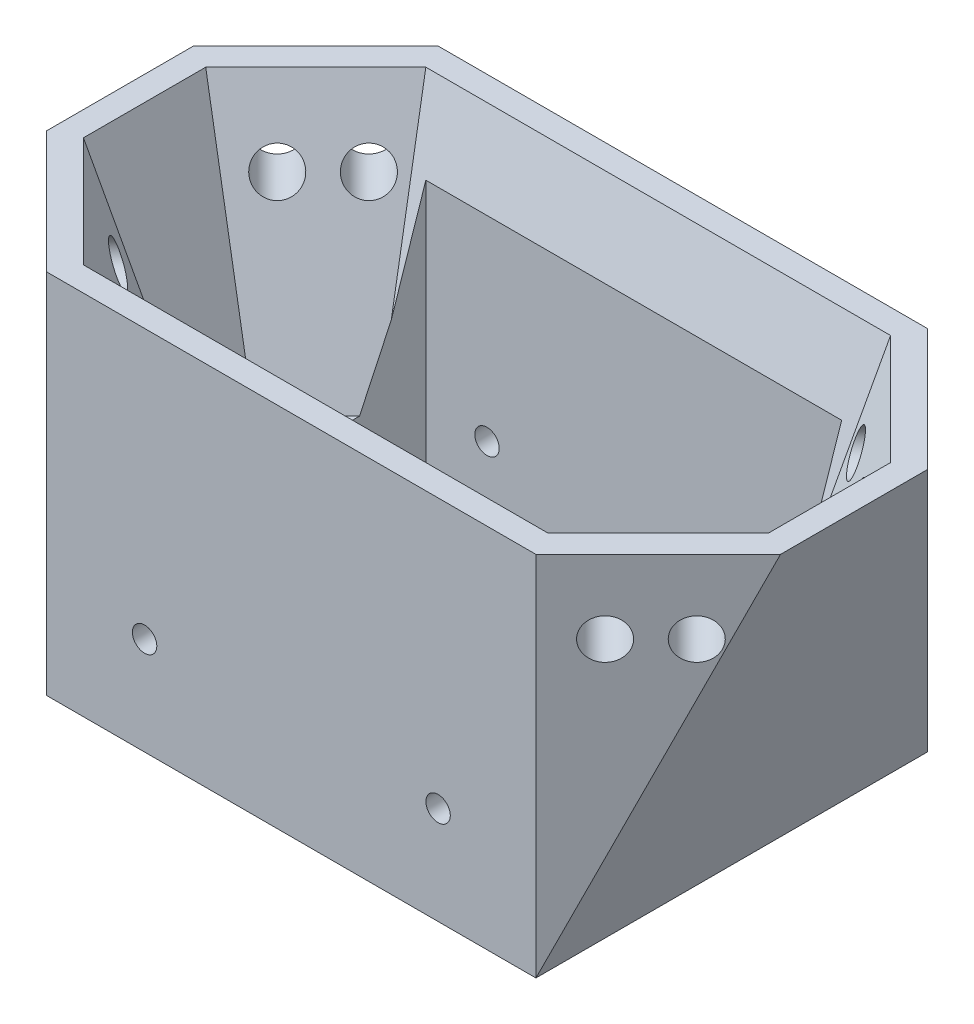
ISO-10303-21;
HEADER;
FILE_DESCRIPTION(('STEP AP214'),'2;1');
FILE_NAME('part.step','',(''),(''),'','','');
FILE_SCHEMA(('AUTOMOTIVE_DESIGN { 1 0 10303 214 1 1 1 1 }'));
ENDSEC;
DATA;
#1=APPLICATION_CONTEXT('core data for automotive mechanical design processes');
#2=APPLICATION_PROTOCOL_DEFINITION('international standard','automotive_design',2000,#1);
#3=PRODUCT_CONTEXT('',#1,'mechanical');
#4=PRODUCT('Part','Part','',(#3));
#5=PRODUCT_RELATED_PRODUCT_CATEGORY('part','',(#4));
#6=PRODUCT_DEFINITION_FORMATION('','',#4);
#7=PRODUCT_DEFINITION_CONTEXT('part definition',#1,'design');
#8=PRODUCT_DEFINITION('design','',#6,#7);
#9=PRODUCT_DEFINITION_SHAPE('','',#8);
#10=(LENGTH_UNIT() NAMED_UNIT(*) SI_UNIT(.MILLI.,.METRE.));
#11=(NAMED_UNIT(*) PLANE_ANGLE_UNIT() SI_UNIT($,.RADIAN.));
#12=(NAMED_UNIT(*) SI_UNIT($,.STERADIAN.) SOLID_ANGLE_UNIT());
#13=UNCERTAINTY_MEASURE_WITH_UNIT(LENGTH_MEASURE(1.E-05),#10,'distance_accuracy_value','');
#14=(GEOMETRIC_REPRESENTATION_CONTEXT(3) GLOBAL_UNCERTAINTY_ASSIGNED_CONTEXT((#13)) GLOBAL_UNIT_ASSIGNED_CONTEXT((#10,
#11,#12)) REPRESENTATION_CONTEXT('',''));
#15=CARTESIAN_POINT('',(0.,0.,0.));
#16=DIRECTION('',(0.,0.,1.));
#17=DIRECTION('',(1.,0.,0.));
#18=AXIS2_PLACEMENT_3D('',#15,#16,#17);
#19=CARTESIAN_POINT('',(-100.,150.,80.));
#20=DIRECTION('',(0.707106781186548,0.,-0.707106781186548));
#21=DIRECTION('',(-0.707106781186548,0.,-0.707106781186548));
#22=AXIS2_PLACEMENT_3D('',#19,#20,#21);
#23=PLANE('',#22);
#24=CARTESIAN_POINT('',(-114.142135623731,120.,65.857864376269));
#25=DIRECTION('',(-0.707106781186548,0.,0.707106781186547));
#26=DIRECTION('',(0.707106781186547,0.,0.707106781186548));
#27=AXIS2_PLACEMENT_3D('',#24,#25,#26);
#28=CIRCLE('',#27,8.25000000000001);
#29=CARTESIAN_POINT('',(-108.308504678942,120.,71.6914953210581));
#30=VERTEX_POINT('',#29);
#31=EDGE_CURVE('E357',#30,#30,#28,.T.);
#32=ORIENTED_EDGE('',*,*,#31,.F.);
#33=EDGE_LOOP('',(#32));
#34=FACE_BOUND('',#33,.T.);
#35=CARTESIAN_POINT('',(-132.880465325174,120.,47.1195346748255));
#36=DIRECTION('',(-0.707106781186548,0.,0.707106781186547));
#37=DIRECTION('',(0.707106781186547,0.,0.707106781186548));
#38=AXIS2_PLACEMENT_3D('',#35,#36,#37);
#39=CIRCLE('',#38,8.25000000000002);
#40=CARTESIAN_POINT('',(-127.046834380385,120.,52.9531656196146));
#41=VERTEX_POINT('',#40);
#42=EDGE_CURVE('E347',#41,#41,#39,.T.);
#43=ORIENTED_EDGE('',*,*,#42,.F.);
#44=EDGE_LOOP('',(#43));
#45=FACE_BOUND('',#44,.T.);
#46=DIRECTION('',(0.707106781186547,0.,0.707106781186547));
#47=VECTOR('',#46,1.);
#48=CARTESIAN_POINT('',(-100.,150.,80.));
#49=LINE('',#48,#47);
#50=CARTESIAN_POINT('',(-150.,150.,30.));
#51=VERTEX_POINT('',#50);
#52=CARTESIAN_POINT('',(-100.,150.,80.));
#53=VERTEX_POINT('',#52);
#54=EDGE_CURVE('E295',#51,#53,#49,.T.);
#55=ORIENTED_EDGE('',*,*,#54,.F.);
#56=DIRECTION('',(0.301511344577764,-0.904534033733291,0.301511344577764));
#57=VECTOR('',#56,1.);
#58=CARTESIAN_POINT('',(-140.909090909091,122.727272727273,39.0909090909091));
#59=LINE('',#58,#57);
#60=CARTESIAN_POINT('',(-100.,0.,80.));
#61=VERTEX_POINT('',#60);
#62=EDGE_CURVE('E288',#51,#61,#59,.T.);
#63=ORIENTED_EDGE('',*,*,#62,.T.);
#64=DIRECTION('',(0.,-1.,0.));
#65=VECTOR('',#64,1.);
#66=CARTESIAN_POINT('',(-100.,150.,80.));
#67=LINE('',#66,#65);
#68=EDGE_CURVE('E326',#53,#61,#67,.T.);
#69=ORIENTED_EDGE('',*,*,#68,.F.);
#70=EDGE_LOOP('',(#55,#63,#69));
#71=FACE_BOUND('',#70,.T.);
#72=ADVANCED_FACE('F37',(#34,#45,#71),#23,.F.);
#73=CARTESIAN_POINT('',(100.,150.,80.));
#74=DIRECTION('',(0.,0.,-1.));
#75=DIRECTION('',(-1.,0.,0.));
#76=AXIS2_PLACEMENT_3D('',#73,#74,#75);
#77=PLANE('',#76);
#78=CARTESIAN_POINT('',(-60.,40.,80.));
#79=DIRECTION('',(0.,0.,1.));
#80=DIRECTION('',(1.,0.,0.));
#81=AXIS2_PLACEMENT_3D('',#78,#79,#80);
#82=CIRCLE('',#81,5.);
#83=CARTESIAN_POINT('',(-55.,40.,80.));
#84=VERTEX_POINT('',#83);
#85=EDGE_CURVE('E382',#84,#84,#82,.T.);
#86=ORIENTED_EDGE('',*,*,#85,.F.);
#87=EDGE_LOOP('',(#86));
#88=FACE_BOUND('',#87,.T.);
#89=CARTESIAN_POINT('',(60.,40.,80.));
#90=DIRECTION('',(0.,0.,1.));
#91=DIRECTION('',(1.,0.,0.));
#92=AXIS2_PLACEMENT_3D('',#89,#90,#91);
#93=CIRCLE('',#92,4.99999999999999);
#94=CARTESIAN_POINT('',(65.,40.,80.));
#95=VERTEX_POINT('',#94);
#96=EDGE_CURVE('E392',#95,#95,#93,.T.);
#97=ORIENTED_EDGE('',*,*,#96,.F.);
#98=EDGE_LOOP('',(#97));
#99=FACE_BOUND('',#98,.T.);
#100=DIRECTION('',(1.,0.,0.));
#101=VECTOR('',#100,1.);
#102=CARTESIAN_POINT('',(100.,0.,80.));
#103=LINE('',#102,#101);
#104=CARTESIAN_POINT('',(100.,0.,80.));
#105=VERTEX_POINT('',#104);
#106=EDGE_CURVE('E291',#61,#105,#103,.T.);
#107=ORIENTED_EDGE('',*,*,#106,.T.);
#108=DIRECTION('',(0.,-1.,0.));
#109=VECTOR('',#108,1.);
#110=CARTESIAN_POINT('',(100.,150.,80.));
#111=LINE('',#110,#109);
#112=CARTESIAN_POINT('',(100.,150.,80.));
#113=VERTEX_POINT('',#112);
#114=EDGE_CURVE('E323',#113,#105,#111,.T.);
#115=ORIENTED_EDGE('',*,*,#114,.F.);
#116=DIRECTION('',(1.,0.,0.));
#117=VECTOR('',#116,1.);
#118=CARTESIAN_POINT('',(100.,150.,80.));
#119=LINE('',#118,#117);
#120=EDGE_CURVE('E298',#53,#113,#119,.T.);
#121=ORIENTED_EDGE('',*,*,#120,.F.);
#122=ORIENTED_EDGE('',*,*,#68,.T.);
#123=EDGE_LOOP('',(#107,#115,#121,#122));
#124=FACE_BOUND('',#123,.T.);
#125=ADVANCED_FACE('F421',(#88,#99,#124),#77,.F.);
#126=CARTESIAN_POINT('',(150.,150.,30.));
#127=DIRECTION('',(-0.707106781186547,0.,-0.707106781186548));
#128=DIRECTION('',(-0.707106781186548,0.,0.707106781186547));
#129=AXIS2_PLACEMENT_3D('',#126,#127,#128);
#130=PLANE('',#129);
#131=CARTESIAN_POINT('',(114.142135623731,120.,65.857864376269));
#132=DIRECTION('',(-0.707106781186548,0.,-0.707106781186547));
#133=DIRECTION('',(-0.707106781186547,0.,0.707106781186548));
#134=AXIS2_PLACEMENT_3D('',#131,#132,#133);
#135=CIRCLE('',#134,8.25000000000001);
#136=CARTESIAN_POINT('',(108.308504678942,120.,71.6914953210581));
#137=VERTEX_POINT('',#136);
#138=EDGE_CURVE('E398',#137,#137,#135,.T.);
#139=ORIENTED_EDGE('',*,*,#138,.T.);
#140=EDGE_LOOP('',(#139));
#141=FACE_BOUND('',#140,.T.);
#142=CARTESIAN_POINT('',(132.880465325174,120.,47.1195346748255));
#143=DIRECTION('',(-0.707106781186548,0.,-0.707106781186547));
#144=DIRECTION('',(-0.707106781186547,0.,0.707106781186548));
#145=AXIS2_PLACEMENT_3D('',#142,#143,#144);
#146=CIRCLE('',#145,8.25000000000002);
#147=CARTESIAN_POINT('',(127.046834380385,120.,52.9531656196146));
#148=VERTEX_POINT('',#147);
#149=EDGE_CURVE('E370',#148,#148,#146,.T.);
#150=ORIENTED_EDGE('',*,*,#149,.T.);
#151=EDGE_LOOP('',(#150));
#152=FACE_BOUND('',#151,.T.);
#153=ORIENTED_EDGE('',*,*,#114,.T.);
#154=DIRECTION('',(0.301511344577764,0.904534033733291,-0.301511344577763));
#155=VECTOR('',#154,1.);
#156=CARTESIAN_POINT('',(150.,150.,30.));
#157=LINE('',#156,#155);
#158=CARTESIAN_POINT('',(150.,150.,30.));
#159=VERTEX_POINT('',#158);
#160=EDGE_CURVE('E282',#105,#159,#157,.T.);
#161=ORIENTED_EDGE('',*,*,#160,.T.);
#162=DIRECTION('',(0.707106781186548,0.,-0.707106781186547));
#163=VECTOR('',#162,1.);
#164=CARTESIAN_POINT('',(150.,150.,30.));
#165=LINE('',#164,#163);
#166=EDGE_CURVE('E300',#113,#159,#165,.T.);
#167=ORIENTED_EDGE('',*,*,#166,.F.);
#168=EDGE_LOOP('',(#153,#161,#167));
#169=FACE_BOUND('',#168,.T.);
#170=ADVANCED_FACE('F445',(#141,#152,#169),#130,.F.);
#171=CARTESIAN_POINT('',(100.,150.,-80.));
#172=DIRECTION('',(-0.707106781186548,0.,0.707106781186547));
#173=DIRECTION('',(0.707106781186547,0.,0.707106781186548));
#174=AXIS2_PLACEMENT_3D('',#171,#172,#173);
#175=PLANE('',#174);
#176=CARTESIAN_POINT('',(114.142135623731,120.,-65.857864376269));
#177=DIRECTION('',(0.707106781186548,0.,-0.707106781186547));
#178=DIRECTION('',(-0.707106781186547,0.,-0.707106781186548));
#179=AXIS2_PLACEMENT_3D('',#176,#177,#178);
#180=CIRCLE('',#179,8.25000000000001);
#181=CARTESIAN_POINT('',(108.308504678942,120.,-71.6914953210581));
#182=VERTEX_POINT('',#181);
#183=EDGE_CURVE('E372',#182,#182,#180,.T.);
#184=ORIENTED_EDGE('',*,*,#183,.F.);
#185=EDGE_LOOP('',(#184));
#186=FACE_BOUND('',#185,.T.);
#187=CARTESIAN_POINT('',(132.880465325174,120.,-47.1195346748255));
#188=DIRECTION('',(0.707106781186548,0.,-0.707106781186547));
#189=DIRECTION('',(-0.707106781186547,0.,-0.707106781186548));
#190=AXIS2_PLACEMENT_3D('',#187,#188,#189);
#191=CIRCLE('',#190,8.25000000000002);
#192=CARTESIAN_POINT('',(127.046834380385,120.,-52.9531656196146));
#193=VERTEX_POINT('',#192);
#194=EDGE_CURVE('E362',#193,#193,#191,.T.);
#195=ORIENTED_EDGE('',*,*,#194,.F.);
#196=EDGE_LOOP('',(#195));
#197=FACE_BOUND('',#196,.T.);
#198=DIRECTION('',(-0.707106781186547,0.,-0.707106781186548));
#199=VECTOR('',#198,1.);
#200=CARTESIAN_POINT('',(100.,150.,-80.));
#201=LINE('',#200,#199);
#202=CARTESIAN_POINT('',(150.,150.,-30.));
#203=VERTEX_POINT('',#202);
#204=CARTESIAN_POINT('',(100.,150.,-80.));
#205=VERTEX_POINT('',#204);
#206=EDGE_CURVE('E306',#203,#205,#201,.T.);
#207=ORIENTED_EDGE('',*,*,#206,.F.);
#208=DIRECTION('',(-0.301511344577764,-0.904534033733291,-0.301511344577764));
#209=VECTOR('',#208,1.);
#210=CARTESIAN_POINT('',(140.909090909091,122.727272727273,-39.0909090909091));
#211=LINE('',#210,#209);
#212=CARTESIAN_POINT('',(100.,0.,-80.));
#213=VERTEX_POINT('',#212);
#214=EDGE_CURVE('E277',#203,#213,#211,.T.);
#215=ORIENTED_EDGE('',*,*,#214,.T.);
#216=DIRECTION('',(0.,-1.,0.));
#217=VECTOR('',#216,1.);
#218=CARTESIAN_POINT('',(100.,150.,-80.));
#219=LINE('',#218,#217);
#220=EDGE_CURVE('E320',#205,#213,#219,.T.);
#221=ORIENTED_EDGE('',*,*,#220,.F.);
#222=EDGE_LOOP('',(#207,#215,#221));
#223=FACE_BOUND('',#222,.T.);
#224=ADVANCED_FACE('F449',(#186,#197,#223),#175,.F.);
#225=CARTESIAN_POINT('',(-100.,150.,-80.));
#226=DIRECTION('',(0.,0.,1.));
#227=DIRECTION('',(1.,0.,0.));
#228=AXIS2_PLACEMENT_3D('',#225,#226,#227);
#229=PLANE('',#228);
#230=CARTESIAN_POINT('',(-60.,40.,-80.));
#231=DIRECTION('',(0.,0.,1.));
#232=DIRECTION('',(1.,0.,0.));
#233=AXIS2_PLACEMENT_3D('',#230,#231,#232);
#234=CIRCLE('',#233,5.);
#235=CARTESIAN_POINT('',(-55.,40.,-80.));
#236=VERTEX_POINT('',#235);
#237=EDGE_CURVE('E376',#236,#236,#234,.T.);
#238=ORIENTED_EDGE('',*,*,#237,.T.);
#239=EDGE_LOOP('',(#238));
#240=FACE_BOUND('',#239,.T.);
#241=CARTESIAN_POINT('',(60.,40.,-80.));
#242=DIRECTION('',(0.,0.,1.));
#243=DIRECTION('',(1.,0.,0.));
#244=AXIS2_PLACEMENT_3D('',#241,#242,#243);
#245=CIRCLE('',#244,4.99999999999999);
#246=CARTESIAN_POINT('',(65.,40.,-80.));
#247=VERTEX_POINT('',#246);
#248=EDGE_CURVE('E387',#247,#247,#245,.T.);
#249=ORIENTED_EDGE('',*,*,#248,.T.);
#250=EDGE_LOOP('',(#249));
#251=FACE_BOUND('',#250,.T.);
#252=DIRECTION('',(-1.,0.,0.));
#253=VECTOR('',#252,1.);
#254=CARTESIAN_POINT('',(-100.,0.,-80.));
#255=LINE('',#254,#253);
#256=CARTESIAN_POINT('',(-100.,0.,-80.));
#257=VERTEX_POINT('',#256);
#258=EDGE_CURVE('E296',#213,#257,#255,.T.);
#259=ORIENTED_EDGE('',*,*,#258,.T.);
#260=DIRECTION('',(0.,-1.,0.));
#261=VECTOR('',#260,1.);
#262=CARTESIAN_POINT('',(-100.,150.,-80.));
#263=LINE('',#262,#261);
#264=CARTESIAN_POINT('',(-100.,150.,-80.));
#265=VERTEX_POINT('',#264);
#266=EDGE_CURVE('E313',#265,#257,#263,.T.);
#267=ORIENTED_EDGE('',*,*,#266,.F.);
#268=DIRECTION('',(-1.,0.,0.));
#269=VECTOR('',#268,1.);
#270=CARTESIAN_POINT('',(-100.,150.,-80.));
#271=LINE('',#270,#269);
#272=EDGE_CURVE('E308',#205,#265,#271,.T.);
#273=ORIENTED_EDGE('',*,*,#272,.F.);
#274=ORIENTED_EDGE('',*,*,#220,.T.);
#275=EDGE_LOOP('',(#259,#267,#273,#274));
#276=FACE_BOUND('',#275,.T.);
#277=ADVANCED_FACE('F435',(#240,#251,#276),#229,.F.);
#278=CARTESIAN_POINT('',(-150.,150.,-30.));
#279=DIRECTION('',(0.707106781186547,0.,0.707106781186548));
#280=DIRECTION('',(0.707106781186548,0.,-0.707106781186547));
#281=AXIS2_PLACEMENT_3D('',#278,#279,#280);
#282=PLANE('',#281);
#283=CARTESIAN_POINT('',(-114.142135623731,120.,-65.857864376269));
#284=DIRECTION('',(0.707106781186548,0.,0.707106781186547));
#285=DIRECTION('',(0.707106781186547,0.,-0.707106781186548));
#286=AXIS2_PLACEMENT_3D('',#283,#284,#285);
#287=CIRCLE('',#286,8.25000000000001);
#288=CARTESIAN_POINT('',(-108.308504678942,120.,-71.6914953210581));
#289=VERTEX_POINT('',#288);
#290=EDGE_CURVE('E365',#289,#289,#287,.T.);
#291=ORIENTED_EDGE('',*,*,#290,.T.);
#292=EDGE_LOOP('',(#291));
#293=FACE_BOUND('',#292,.T.);
#294=CARTESIAN_POINT('',(-132.880465325174,120.,-47.1195346748255));
#295=DIRECTION('',(0.707106781186548,0.,0.707106781186547));
#296=DIRECTION('',(0.707106781186547,0.,-0.707106781186548));
#297=AXIS2_PLACEMENT_3D('',#294,#295,#296);
#298=CIRCLE('',#297,8.25000000000002);
#299=CARTESIAN_POINT('',(-127.046834380385,120.,-52.9531656196146));
#300=VERTEX_POINT('',#299);
#301=EDGE_CURVE('E354',#300,#300,#298,.T.);
#302=ORIENTED_EDGE('',*,*,#301,.T.);
#303=EDGE_LOOP('',(#302));
#304=FACE_BOUND('',#303,.T.);
#305=ORIENTED_EDGE('',*,*,#266,.T.);
#306=DIRECTION('',(-0.301511344577764,0.904534033733291,0.301511344577763));
#307=VECTOR('',#306,1.);
#308=CARTESIAN_POINT('',(-150.,150.,-30.));
#309=LINE('',#308,#307);
#310=CARTESIAN_POINT('',(-150.,150.,-30.));
#311=VERTEX_POINT('',#310);
#312=EDGE_CURVE('E285',#257,#311,#309,.T.);
#313=ORIENTED_EDGE('',*,*,#312,.T.);
#314=DIRECTION('',(-0.707106781186548,0.,0.707106781186547));
#315=VECTOR('',#314,1.);
#316=CARTESIAN_POINT('',(-150.,150.,-30.));
#317=LINE('',#316,#315);
#318=EDGE_CURVE('E310',#265,#311,#317,.T.);
#319=ORIENTED_EDGE('',*,*,#318,.F.);
#320=EDGE_LOOP('',(#305,#313,#319));
#321=FACE_BOUND('',#320,.T.);
#322=ADVANCED_FACE('F431',(#293,#304,#321),#282,.F.);
#323=CARTESIAN_POINT('',(0.,150.,0.));
#324=DIRECTION('',(0.,-1.,0.));
#325=DIRECTION('',(0.,0.,-1.));
#326=AXIS2_PLACEMENT_3D('',#323,#324,#325);
#327=PLANE('',#326);
#328=DIRECTION('',(0.707106781186548,0.,0.707106781186547));
#329=VECTOR('',#328,1.);
#330=CARTESIAN_POINT('',(-125.,150.,40.));
#331=LINE('',#330,#329);
#332=CARTESIAN_POINT('',(-140.,150.,25.));
#333=VERTEX_POINT('',#332);
#334=CARTESIAN_POINT('',(-95.,150.,70.));
#335=VERTEX_POINT('',#334);
#336=EDGE_CURVE('E189',#333,#335,#331,.T.);
#337=ORIENTED_EDGE('',*,*,#336,.F.);
#338=DIRECTION('',(0.,0.,1.));
#339=VECTOR('',#338,1.);
#340=CARTESIAN_POINT('',(-140.,150.,-24.9999999999999));
#341=LINE('',#340,#339);
#342=CARTESIAN_POINT('',(-140.,150.,-24.9999999999999));
#343=VERTEX_POINT('',#342);
#344=EDGE_CURVE('E53',#343,#333,#341,.T.);
#345=ORIENTED_EDGE('',*,*,#344,.F.);
#346=DIRECTION('',(-0.707106781186547,0.,0.707106781186548));
#347=VECTOR('',#346,1.);
#348=CARTESIAN_POINT('',(-95.,150.,-70.));
#349=LINE('',#348,#347);
#350=CARTESIAN_POINT('',(-95.,150.,-70.));
#351=VERTEX_POINT('',#350);
#352=EDGE_CURVE('E212',#351,#343,#349,.T.);
#353=ORIENTED_EDGE('',*,*,#352,.F.);
#354=DIRECTION('',(-1.,0.,0.));
#355=VECTOR('',#354,1.);
#356=CARTESIAN_POINT('',(95.,150.,-70.));
#357=LINE('',#356,#355);
#358=CARTESIAN_POINT('',(95.,150.,-70.));
#359=VERTEX_POINT('',#358);
#360=EDGE_CURVE('E209',#359,#351,#357,.T.);
#361=ORIENTED_EDGE('',*,*,#360,.F.);
#362=DIRECTION('',(-0.707106781186547,0.,-0.707106781186547));
#363=VECTOR('',#362,1.);
#364=CARTESIAN_POINT('',(140.,150.,-25.));
#365=LINE('',#364,#363);
#366=CARTESIAN_POINT('',(140.,150.,-25.));
#367=VERTEX_POINT('',#366);
#368=EDGE_CURVE('E206',#367,#359,#365,.T.);
#369=ORIENTED_EDGE('',*,*,#368,.F.);
#370=DIRECTION('',(0.,0.,-1.));
#371=VECTOR('',#370,1.);
#372=CARTESIAN_POINT('',(140.,150.,25.));
#373=LINE('',#372,#371);
#374=CARTESIAN_POINT('',(140.,150.,25.));
#375=VERTEX_POINT('',#374);
#376=EDGE_CURVE('E200',#375,#367,#373,.T.);
#377=ORIENTED_EDGE('',*,*,#376,.F.);
#378=DIRECTION('',(0.707106781186547,0.,-0.707106781186548));
#379=VECTOR('',#378,1.);
#380=CARTESIAN_POINT('',(95.,150.,70.));
#381=LINE('',#380,#379);
#382=CARTESIAN_POINT('',(95.,150.,70.));
#383=VERTEX_POINT('',#382);
#384=EDGE_CURVE('E198',#383,#375,#381,.T.);
#385=ORIENTED_EDGE('',*,*,#384,.F.);
#386=DIRECTION('',(1.,0.,0.));
#387=VECTOR('',#386,1.);
#388=CARTESIAN_POINT('',(-95.,150.,70.));
#389=LINE('',#388,#387);
#390=EDGE_CURVE('E179',#335,#383,#389,.T.);
#391=ORIENTED_EDGE('',*,*,#390,.F.);
#392=EDGE_LOOP('',(#337,#345,#353,#361,#369,#377,#385,#391));
#393=FACE_BOUND('',#392,.T.);
#394=DIRECTION('',(0.,0.,1.));
#395=VECTOR('',#394,1.);
#396=CARTESIAN_POINT('',(-150.,150.,30.));
#397=LINE('',#396,#395);
#398=EDGE_CURVE('E292',#311,#51,#397,.T.);
#399=ORIENTED_EDGE('',*,*,#398,.T.);
#400=ORIENTED_EDGE('',*,*,#54,.T.);
#401=ORIENTED_EDGE('',*,*,#120,.T.);
#402=ORIENTED_EDGE('',*,*,#166,.T.);
#403=DIRECTION('',(0.,0.,-1.));
#404=VECTOR('',#403,1.);
#405=CARTESIAN_POINT('',(150.,150.,-30.));
#406=LINE('',#405,#404);
#407=EDGE_CURVE('E303',#159,#203,#406,.T.);
#408=ORIENTED_EDGE('',*,*,#407,.T.);
#409=ORIENTED_EDGE('',*,*,#206,.T.);
#410=ORIENTED_EDGE('',*,*,#272,.T.);
#411=ORIENTED_EDGE('',*,*,#318,.T.);
#412=EDGE_LOOP('',(#399,#400,#401,#402,#408,#409,#410,#411));
#413=FACE_BOUND('',#412,.T.);
#414=ADVANCED_FACE('F194',(#393,#413),#327,.F.);
#415=CARTESIAN_POINT('',(0.,0.,0.));
#416=DIRECTION('',(0.,-1.,0.));
#417=DIRECTION('',(0.,0.,-1.));
#418=AXIS2_PLACEMENT_3D('',#415,#416,#417);
#419=PLANE('',#418);
#420=DIRECTION('',(0.,0.,1.));
#421=VECTOR('',#420,1.);
#422=CARTESIAN_POINT('',(-100.,0.,-80.));
#423=LINE('',#422,#421);
#424=EDGE_CURVE('E275',#257,#61,#423,.T.);
#425=ORIENTED_EDGE('',*,*,#424,.F.);
#426=ORIENTED_EDGE('',*,*,#258,.F.);
#427=DIRECTION('',(0.,0.,1.));
#428=VECTOR('',#427,1.);
#429=CARTESIAN_POINT('',(100.,0.,-80.));
#430=LINE('',#429,#428);
#431=EDGE_CURVE('E272',#213,#105,#430,.T.);
#432=ORIENTED_EDGE('',*,*,#431,.T.);
#433=ORIENTED_EDGE('',*,*,#106,.F.);
#434=EDGE_LOOP('',(#425,#426,#432,#433));
#435=FACE_BOUND('',#434,.T.);
#436=ADVANCED_FACE('F439',(#435),#419,.T.);
#437=CARTESIAN_POINT('',(100.,0.,-80.));
#438=DIRECTION('',(-0.948683298050514,0.316227766016838,0.));
#439=DIRECTION('',(-0.316227766016838,-0.948683298050514,0.));
#440=AXIS2_PLACEMENT_3D('',#437,#438,#439);
#441=PLANE('',#440);
#442=ORIENTED_EDGE('',*,*,#431,.F.);
#443=ORIENTED_EDGE('',*,*,#214,.F.);
#444=ORIENTED_EDGE('',*,*,#407,.F.);
#445=ORIENTED_EDGE('',*,*,#160,.F.);
#446=EDGE_LOOP('',(#442,#443,#444,#445));
#447=FACE_BOUND('',#446,.T.);
#448=ADVANCED_FACE('F450',(#447),#441,.F.);
#449=CARTESIAN_POINT('',(-150.,150.,-80.));
#450=DIRECTION('',(0.948683298050514,0.316227766016838,0.));
#451=DIRECTION('',(-0.316227766016838,0.948683298050514,0.));
#452=AXIS2_PLACEMENT_3D('',#449,#450,#451);
#453=PLANE('',#452);
#454=ORIENTED_EDGE('',*,*,#398,.F.);
#455=ORIENTED_EDGE('',*,*,#312,.F.);
#456=ORIENTED_EDGE('',*,*,#424,.T.);
#457=ORIENTED_EDGE('',*,*,#62,.F.);
#458=EDGE_LOOP('',(#454,#455,#456,#457));
#459=FACE_BOUND('',#458,.T.);
#460=ADVANCED_FACE('F428',(#459),#453,.F.);
#461=CARTESIAN_POINT('',(-95.,150.,-70.));
#462=DIRECTION('',(-0.670839704394397,-0.316145823973806,-0.670839704394396));
#463=DIRECTION('',(-0.707106781186547,0.,0.707106781186548));
#464=AXIS2_PLACEMENT_3D('',#461,#462,#463);
#465=PLANE('',#464);
#466=CARTESIAN_POINT('',(-99.5731035903809,120.,-51.2888323429189));
#467=DIRECTION('',(-0.670839704394397,-0.316145823973806,-0.670839704394396));
#468=DIRECTION('',(-0.223548855975687,0.948710608132914,-0.223548855975688));
#469=AXIS2_PLACEMENT_3D('',#466,#467,#468);
#470=ELLIPSE('',#469,8.69601323024754,8.25000000000001);
#471=CARTESIAN_POINT('',(-101.517087399552,128.25,-53.2328161520902));
#472=VERTEX_POINT('',#471);
#473=EDGE_CURVE('E353',#472,#472,#470,.F.);
#474=ORIENTED_EDGE('',*,*,#473,.F.);
#475=EDGE_LOOP('',(#474));
#476=FACE_BOUND('',#475,.T.);
#477=CARTESIAN_POINT('',(-118.311433291824,120.,-32.5505026414754));
#478=DIRECTION('',(-0.670839704394397,-0.316145823973806,-0.670839704394396));
#479=DIRECTION('',(-0.223548855975687,0.948710608132914,-0.223548855975688));
#480=AXIS2_PLACEMENT_3D('',#477,#478,#479);
#481=ELLIPSE('',#480,8.69601323024755,8.25000000000002);
#482=CARTESIAN_POINT('',(-120.255417100996,128.25,-34.4944864506467));
#483=VERTEX_POINT('',#482);
#484=EDGE_CURVE('E350',#483,#483,#481,.F.);
#485=ORIENTED_EDGE('',*,*,#484,.F.);
#486=EDGE_LOOP('',(#485));
#487=FACE_BOUND('',#486,.T.);
#488=DIRECTION('',(-0.129843317945817,0.940679321488459,-0.313469499168313));
#489=VECTOR('',#488,1.);
#490=CARTESIAN_POINT('',(-91.796735429116,126.793224397235,-62.2666352291028));
#491=LINE('',#490,#489);
#492=CARTESIAN_POINT('',(-85.,77.5527353759554,-45.8578643762691));
#493=VERTEX_POINT('',#492);
#494=EDGE_CURVE('E218',#493,#351,#491,.T.);
#495=ORIENTED_EDGE('',*,*,#494,.T.);
#496=ORIENTED_EDGE('',*,*,#352,.T.);
#497=DIRECTION('',(-0.313469499168313,0.940679321488459,-0.129843317945817));
#498=VECTOR('',#497,1.);
#499=CARTESIAN_POINT('',(-137.40974568221,142.226999179805,-23.9270815315757));
#500=LINE('',#499,#498);
#501=CARTESIAN_POINT('',(-106.676263418621,50.,-11.1968563590445));
#502=VERTEX_POINT('',#501);
#503=EDGE_CURVE('E216',#502,#343,#500,.T.);
#504=ORIENTED_EDGE('',*,*,#503,.F.);
#505=DIRECTION('',(-0.707106781186547,0.,0.707106781186548));
#506=VECTOR('',#505,1.);
#507=CARTESIAN_POINT('',(-58.936559888833,50.,-58.936559888833));
#508=LINE('',#507,#506);
#509=CARTESIAN_POINT('',(-85.,50.,-32.873119777666));
#510=VERTEX_POINT('',#509);
#511=EDGE_CURVE('E219',#510,#502,#508,.T.);
#512=ORIENTED_EDGE('',*,*,#511,.F.);
#513=DIRECTION('',(0.,-0.904581379300352,0.426300983136414));
#514=VECTOR('',#513,1.);
#515=CARTESIAN_POINT('',(-85.,27.7300753247775,-22.3779990503699));
#516=LINE('',#515,#514);
#517=EDGE_CURVE('E11',#493,#510,#516,.T.);
#518=ORIENTED_EDGE('',*,*,#517,.F.);
#519=EDGE_LOOP('',(#495,#496,#504,#512,#518));
#520=FACE_BOUND('',#519,.T.);
#521=ADVANCED_FACE('F457',(#476,#487,#520),#465,.F.);
#522=CARTESIAN_POINT('',(-125.,150.,40.));
#523=DIRECTION('',(-0.670839704394397,-0.316145823973806,0.670839704394397));
#524=DIRECTION('',(0.707106781186548,0.,0.707106781186547));
#525=AXIS2_PLACEMENT_3D('',#522,#523,#524);
#526=PLANE('',#525);
#527=CARTESIAN_POINT('',(-99.5731035903809,120.,51.288832342919));
#528=DIRECTION('',(-0.670839704394397,-0.316145823973806,0.670839704394397));
#529=DIRECTION('',(-0.223548855975688,0.948710608132914,0.223548855975687));
#530=AXIS2_PLACEMENT_3D('',#527,#528,#529);
#531=ELLIPSE('',#530,8.69601323024754,8.25000000000001);
#532=CARTESIAN_POINT('',(-101.517087399552,128.25,53.2328161520902));
#533=VERTEX_POINT('',#532);
#534=EDGE_CURVE('E346',#533,#533,#531,.T.);
#535=ORIENTED_EDGE('',*,*,#534,.T.);
#536=EDGE_LOOP('',(#535));
#537=FACE_BOUND('',#536,.T.);
#538=CARTESIAN_POINT('',(-118.311433291824,120.,32.5505026414755));
#539=DIRECTION('',(-0.670839704394397,-0.316145823973806,0.670839704394397));
#540=DIRECTION('',(-0.223548855975688,0.948710608132914,0.223548855975687));
#541=AXIS2_PLACEMENT_3D('',#538,#539,#540);
#542=ELLIPSE('',#541,8.69601323024755,8.25000000000002);
#543=CARTESIAN_POINT('',(-120.255417100996,128.25,34.4944864506467));
#544=VERTEX_POINT('',#543);
#545=EDGE_CURVE('E343',#544,#544,#542,.T.);
#546=ORIENTED_EDGE('',*,*,#545,.T.);
#547=EDGE_LOOP('',(#546));
#548=FACE_BOUND('',#547,.T.);
#549=DIRECTION('',(0.707106781186548,0.,0.707106781186547));
#550=VECTOR('',#549,1.);
#551=CARTESIAN_POINT('',(-58.936559888833,50.,58.936559888833));
#552=LINE('',#551,#550);
#553=CARTESIAN_POINT('',(-106.676263418621,50.,11.1968563590446));
#554=VERTEX_POINT('',#553);
#555=CARTESIAN_POINT('',(-85.,50.,32.873119777666));
#556=VERTEX_POINT('',#555);
#557=EDGE_CURVE('E231',#554,#556,#552,.T.);
#558=ORIENTED_EDGE('',*,*,#557,.F.);
#559=DIRECTION('',(-0.313469499168313,0.940679321488459,0.129843317945817));
#560=VECTOR('',#559,1.);
#561=CARTESIAN_POINT('',(-137.964904007659,143.892953788746,24.1570356392411));
#562=LINE('',#561,#560);
#563=EDGE_CURVE('E186',#554,#333,#562,.T.);
#564=ORIENTED_EDGE('',*,*,#563,.T.);
#565=ORIENTED_EDGE('',*,*,#336,.T.);
#566=DIRECTION('',(-0.129843317945817,0.940679321488459,0.313469499168313));
#567=VECTOR('',#566,1.);
#568=CARTESIAN_POINT('',(-94.2847210210505,144.817999453203,68.2731637881398));
#569=LINE('',#568,#567);
#570=CARTESIAN_POINT('',(-85.,77.5527353759558,45.8578643762693));
#571=VERTEX_POINT('',#570);
#572=EDGE_CURVE('E175',#571,#335,#569,.T.);
#573=ORIENTED_EDGE('',*,*,#572,.F.);
#574=DIRECTION('',(0.,0.904581379300352,0.426300983136413));
#575=VECTOR('',#574,1.);
#576=CARTESIAN_POINT('',(-85.,-18.5447964339385,0.570095663601243));
#577=LINE('',#576,#575);
#578=EDGE_CURVE('E45',#556,#571,#577,.T.);
#579=ORIENTED_EDGE('',*,*,#578,.F.);
#580=EDGE_LOOP('',(#558,#564,#565,#573,#579));
#581=FACE_BOUND('',#580,.T.);
#582=ADVANCED_FACE('F191',(#537,#548,#581),#526,.F.);
#583=CARTESIAN_POINT('',(140.,150.,-25.));
#584=DIRECTION('',(0.670839704394397,-0.316145823973806,-0.670839704394397));
#585=DIRECTION('',(-0.707106781186548,0.,-0.707106781186548));
#586=AXIS2_PLACEMENT_3D('',#583,#584,#585);
#587=PLANE('',#586);
#588=CARTESIAN_POINT('',(99.5731035903809,120.,-51.288832342919));
#589=DIRECTION('',(0.670839704394397,-0.316145823973806,-0.670839704394397));
#590=DIRECTION('',(0.223548855975688,0.948710608132914,-0.223548855975687));
#591=AXIS2_PLACEMENT_3D('',#588,#589,#590);
#592=ELLIPSE('',#591,8.69601323024754,8.25000000000001);
#593=CARTESIAN_POINT('',(101.517087399552,128.25,-53.2328161520902));
#594=VERTEX_POINT('',#593);
#595=EDGE_CURVE('E361',#594,#594,#592,.T.);
#596=ORIENTED_EDGE('',*,*,#595,.T.);
#597=EDGE_LOOP('',(#596));
#598=FACE_BOUND('',#597,.T.);
#599=CARTESIAN_POINT('',(118.311433291824,120.,-32.5505026414755));
#600=DIRECTION('',(0.670839704394397,-0.316145823973806,-0.670839704394397));
#601=DIRECTION('',(0.223548855975688,0.948710608132914,-0.223548855975687));
#602=AXIS2_PLACEMENT_3D('',#599,#600,#601);
#603=ELLIPSE('',#602,8.69601323024755,8.25000000000002);
#604=CARTESIAN_POINT('',(120.255417100996,128.25,-34.4944864506467));
#605=VERTEX_POINT('',#604);
#606=EDGE_CURVE('E358',#605,#605,#603,.T.);
#607=ORIENTED_EDGE('',*,*,#606,.T.);
#608=EDGE_LOOP('',(#607));
#609=FACE_BOUND('',#608,.T.);
#610=DIRECTION('',(-0.707106781186548,0.,-0.707106781186548));
#611=VECTOR('',#610,1.);
#612=CARTESIAN_POINT('',(58.936559888833,50.,-58.936559888833));
#613=LINE('',#612,#611);
#614=CARTESIAN_POINT('',(106.676263418621,50.,-11.1968563590446));
#615=VERTEX_POINT('',#614);
#616=CARTESIAN_POINT('',(85.,50.,-32.873119777666));
#617=VERTEX_POINT('',#616);
#618=EDGE_CURVE('E233',#615,#617,#613,.T.);
#619=ORIENTED_EDGE('',*,*,#618,.F.);
#620=DIRECTION('',(0.313469499168313,0.940679321488459,-0.129843317945817));
#621=VECTOR('',#620,1.);
#622=CARTESIAN_POINT('',(137.964904007659,143.892953788746,-24.1570356392411));
#623=LINE('',#622,#621);
#624=EDGE_CURVE('E224',#615,#367,#623,.T.);
#625=ORIENTED_EDGE('',*,*,#624,.T.);
#626=ORIENTED_EDGE('',*,*,#368,.T.);
#627=DIRECTION('',(0.129843317945817,0.940679321488459,-0.313469499168313));
#628=VECTOR('',#627,1.);
#629=CARTESIAN_POINT('',(93.9270815315758,142.226999179805,-67.4097456822098));
#630=LINE('',#629,#628);
#631=CARTESIAN_POINT('',(85.,77.5527353759546,-45.8578643762689));
#632=VERTEX_POINT('',#631);
#633=EDGE_CURVE('E226',#632,#359,#630,.T.);
#634=ORIENTED_EDGE('',*,*,#633,.F.);
#635=DIRECTION('',(0.,0.904581379300352,-0.426300983136413));
#636=VECTOR('',#635,1.);
#637=CARTESIAN_POINT('',(85.,183.200894962394,-95.6465460016702));
#638=LINE('',#637,#636);
#639=EDGE_CURVE('E339',#617,#632,#638,.T.);
#640=ORIENTED_EDGE('',*,*,#639,.F.);
#641=EDGE_LOOP('',(#619,#625,#626,#634,#640));
#642=FACE_BOUND('',#641,.T.);
#643=ADVANCED_FACE('F527',(#598,#609,#642),#587,.F.);
#644=CARTESIAN_POINT('',(95.,150.,70.));
#645=DIRECTION('',(0.670839704394397,-0.316145823973806,0.670839704394397));
#646=DIRECTION('',(0.707106781186547,0.,-0.707106781186548));
#647=AXIS2_PLACEMENT_3D('',#644,#645,#646);
#648=PLANE('',#647);
#649=CARTESIAN_POINT('',(99.5731035903809,120.,51.288832342919));
#650=DIRECTION('',(0.670839704394397,-0.316145823973806,0.670839704394397));
#651=DIRECTION('',(0.223548855975687,0.948710608132914,0.223548855975687));
#652=AXIS2_PLACEMENT_3D('',#649,#650,#651);
#653=ELLIPSE('',#652,8.69601323024754,8.25000000000001);
#654=CARTESIAN_POINT('',(101.517087399552,128.25,53.2328161520902));
#655=VERTEX_POINT('',#654);
#656=EDGE_CURVE('E369',#655,#655,#653,.F.);
#657=ORIENTED_EDGE('',*,*,#656,.F.);
#658=EDGE_LOOP('',(#657));
#659=FACE_BOUND('',#658,.T.);
#660=CARTESIAN_POINT('',(118.311433291824,120.,32.5505026414755));
#661=DIRECTION('',(0.670839704394397,-0.316145823973806,0.670839704394397));
#662=DIRECTION('',(0.223548855975687,0.948710608132914,0.223548855975687));
#663=AXIS2_PLACEMENT_3D('',#660,#661,#662);
#664=ELLIPSE('',#663,8.69601323024755,8.25000000000002);
#665=CARTESIAN_POINT('',(120.255417100996,128.25,34.4944864506467));
#666=VERTEX_POINT('',#665);
#667=EDGE_CURVE('E366',#666,#666,#664,.F.);
#668=ORIENTED_EDGE('',*,*,#667,.F.);
#669=EDGE_LOOP('',(#668));
#670=FACE_BOUND('',#669,.T.);
#671=DIRECTION('',(0.129843317945817,0.940679321488459,0.313469499168313));
#672=VECTOR('',#671,1.);
#673=CARTESIAN_POINT('',(91.7967354291161,126.793224397235,62.2666352291028));
#674=LINE('',#673,#672);
#675=CARTESIAN_POINT('',(85.,77.5527353759552,45.8578643762691));
#676=VERTEX_POINT('',#675);
#677=EDGE_CURVE('E185',#676,#383,#674,.T.);
#678=ORIENTED_EDGE('',*,*,#677,.T.);
#679=ORIENTED_EDGE('',*,*,#384,.T.);
#680=DIRECTION('',(0.313469499168313,0.940679321488459,0.129843317945817));
#681=VECTOR('',#680,1.);
#682=CARTESIAN_POINT('',(137.40974568221,142.226999179805,23.9270815315758));
#683=LINE('',#682,#681);
#684=CARTESIAN_POINT('',(106.676263418621,50.,11.1968563590446));
#685=VERTEX_POINT('',#684);
#686=EDGE_CURVE('E222',#685,#375,#683,.T.);
#687=ORIENTED_EDGE('',*,*,#686,.F.);
#688=DIRECTION('',(0.707106781186547,0.,-0.707106781186548));
#689=VECTOR('',#688,1.);
#690=CARTESIAN_POINT('',(58.936559888833,50.,58.936559888833));
#691=LINE('',#690,#689);
#692=CARTESIAN_POINT('',(85.,50.,32.873119777666));
#693=VERTEX_POINT('',#692);
#694=EDGE_CURVE('E239',#693,#685,#691,.T.);
#695=ORIENTED_EDGE('',*,*,#694,.F.);
#696=DIRECTION('',(0.,-0.904581379300352,-0.426300983136413));
#697=VECTOR('',#696,1.);
#698=CARTESIAN_POINT('',(85.,136.926023203678,73.8386426149015));
#699=LINE('',#698,#697);
#700=EDGE_CURVE('E336',#676,#693,#699,.T.);
#701=ORIENTED_EDGE('',*,*,#700,.F.);
#702=EDGE_LOOP('',(#678,#679,#687,#695,#701));
#703=FACE_BOUND('',#702,.T.);
#704=ADVANCED_FACE('F543',(#659,#670,#703),#648,.F.);
#705=CARTESIAN_POINT('',(0.,50.,0.));
#706=DIRECTION('',(0.,1.,0.));
#707=DIRECTION('',(0.,0.,1.));
#708=AXIS2_PLACEMENT_3D('',#705,#706,#707);
#709=PLANE('',#708);
#710=DIRECTION('',(0.,0.,-1.));
#711=VECTOR('',#710,1.);
#712=CARTESIAN_POINT('',(-85.,50.,-60.));
#713=LINE('',#712,#711);
#714=EDGE_CURVE('E251',#556,#510,#713,.T.);
#715=ORIENTED_EDGE('',*,*,#714,.T.);
#716=ORIENTED_EDGE('',*,*,#511,.T.);
#717=DIRECTION('',(0.,0.,1.));
#718=VECTOR('',#717,1.);
#719=CARTESIAN_POINT('',(-106.676263418621,50.,0.));
#720=LINE('',#719,#718);
#721=EDGE_CURVE('E215',#502,#554,#720,.T.);
#722=ORIENTED_EDGE('',*,*,#721,.T.);
#723=ORIENTED_EDGE('',*,*,#557,.T.);
#724=EDGE_LOOP('',(#715,#716,#722,#723));
#725=FACE_BOUND('',#724,.T.);
#726=ADVANCED_FACE('F588',(#725),#709,.T.);
#727=DIRECTION('',(0.,0.,1.));
#728=VECTOR('',#727,1.);
#729=CARTESIAN_POINT('',(85.,50.,-60.));
#730=LINE('',#729,#728);
#731=EDGE_CURVE('E334',#617,#693,#730,.T.);
#732=ORIENTED_EDGE('',*,*,#731,.T.);
#733=ORIENTED_EDGE('',*,*,#694,.T.);
#734=DIRECTION('',(0.,0.,-1.));
#735=VECTOR('',#734,1.);
#736=CARTESIAN_POINT('',(106.676263418621,50.,0.));
#737=LINE('',#736,#735);
#738=EDGE_CURVE('E236',#685,#615,#737,.T.);
#739=ORIENTED_EDGE('',*,*,#738,.T.);
#740=ORIENTED_EDGE('',*,*,#618,.T.);
#741=EDGE_LOOP('',(#732,#733,#739,#740));
#742=FACE_BOUND('',#741,.T.);
#743=ADVANCED_FACE('F547',(#742),#709,.T.);
#744=CARTESIAN_POINT('',(95.,150.,-70.));
#745=DIRECTION('',(0.,-0.316145823973806,-0.948710608132914));
#746=DIRECTION('',(0.,0.948710608132914,-0.316145823973806));
#747=AXIS2_PLACEMENT_3D('',#744,#745,#746);
#748=PLANE('',#747);
#749=DIRECTION('',(-1.,0.,0.));
#750=VECTOR('',#749,1.);
#751=CARTESIAN_POINT('',(0.,119.991360435888,-60.));
#752=LINE('',#751,#750);
#753=CARTESIAN_POINT('',(85.,119.991360435888,-60.));
#754=VERTEX_POINT('',#753);
#755=CARTESIAN_POINT('',(-85.,119.991360435888,-60.));
#756=VERTEX_POINT('',#755);
#757=EDGE_CURVE('E331',#754,#756,#752,.T.);
#758=ORIENTED_EDGE('',*,*,#757,.F.);
#759=DIRECTION('',(0.,0.948710608132914,-0.316145823973806));
#760=VECTOR('',#759,1.);
#761=CARTESIAN_POINT('',(85.,192.003281929987,-83.9970630258828));
#762=LINE('',#761,#760);
#763=EDGE_CURVE('E245',#632,#754,#762,.T.);
#764=ORIENTED_EDGE('',*,*,#763,.F.);
#765=ORIENTED_EDGE('',*,*,#633,.T.);
#766=ORIENTED_EDGE('',*,*,#360,.T.);
#767=ORIENTED_EDGE('',*,*,#494,.F.);
#768=DIRECTION('',(0.,-0.948710608132914,0.316145823973806));
#769=VECTOR('',#768,1.);
#770=CARTESIAN_POINT('',(-85.,20.9934365130421,-27.0101926109173));
#771=LINE('',#770,#769);
#772=EDGE_CURVE('E248',#756,#493,#771,.T.);
#773=ORIENTED_EDGE('',*,*,#772,.F.);
#774=EDGE_LOOP('',(#758,#764,#765,#766,#767,#773));
#775=FACE_BOUND('',#774,.T.);
#776=ADVANCED_FACE('F524',(#775),#748,.F.);
#777=CARTESIAN_POINT('',(-95.,150.,70.));
#778=DIRECTION('',(0.,-0.316145823973806,0.948710608132914));
#779=DIRECTION('',(0.,-0.948710608132914,-0.316145823973806));
#780=AXIS2_PLACEMENT_3D('',#777,#778,#779);
#781=PLANE('',#780);
#782=ORIENTED_EDGE('',*,*,#572,.T.);
#783=ORIENTED_EDGE('',*,*,#390,.T.);
#784=ORIENTED_EDGE('',*,*,#677,.F.);
#785=DIRECTION('',(0.,-0.948710608132914,-0.316145823973806));
#786=VECTOR('',#785,1.);
#787=CARTESIAN_POINT('',(85.,156.011574299483,72.0032811839536));
#788=LINE('',#787,#786);
#789=CARTESIAN_POINT('',(85.,119.991360435888,60.));
#790=VERTEX_POINT('',#789);
#791=EDGE_CURVE('E61',#790,#676,#788,.T.);
#792=ORIENTED_EDGE('',*,*,#791,.F.);
#793=DIRECTION('',(-1.,0.,0.));
#794=VECTOR('',#793,1.);
#795=CARTESIAN_POINT('',(0.,119.991360435888,60.));
#796=LINE('',#795,#794);
#797=CARTESIAN_POINT('',(-85.,119.991360435888,60.));
#798=VERTEX_POINT('',#797);
#799=EDGE_CURVE('E329',#790,#798,#796,.T.);
#800=ORIENTED_EDGE('',*,*,#799,.T.);
#801=DIRECTION('',(0.,0.948710608132914,0.316145823973806));
#802=VECTOR('',#801,1.);
#803=CARTESIAN_POINT('',(-85.,-14.9982711174625,15.016410768988));
#804=LINE('',#803,#802);
#805=EDGE_CURVE('E182',#571,#798,#804,.T.);
#806=ORIENTED_EDGE('',*,*,#805,.F.);
#807=EDGE_LOOP('',(#782,#783,#784,#792,#800,#806));
#808=FACE_BOUND('',#807,.T.);
#809=ADVANCED_FACE('F177',(#808),#781,.F.);
#810=CARTESIAN_POINT('',(-140.,150.,-24.9999999999999));
#811=DIRECTION('',(-0.948710608132914,-0.316145823973806,0.));
#812=DIRECTION('',(0.316145823973806,-0.948710608132914,0.));
#813=AXIS2_PLACEMENT_3D('',#810,#811,#812);
#814=PLANE('',#813);
#815=ORIENTED_EDGE('',*,*,#344,.T.);
#816=ORIENTED_EDGE('',*,*,#563,.F.);
#817=ORIENTED_EDGE('',*,*,#721,.F.);
#818=ORIENTED_EDGE('',*,*,#503,.T.);
#819=EDGE_LOOP('',(#815,#816,#817,#818));
#820=FACE_BOUND('',#819,.T.);
#821=ADVANCED_FACE('F551',(#820),#814,.F.);
#822=CARTESIAN_POINT('',(140.,150.,25.));
#823=DIRECTION('',(0.948710608132914,-0.316145823973806,0.));
#824=DIRECTION('',(0.316145823973806,0.948710608132914,0.));
#825=AXIS2_PLACEMENT_3D('',#822,#823,#824);
#826=PLANE('',#825);
#827=ORIENTED_EDGE('',*,*,#376,.T.);
#828=ORIENTED_EDGE('',*,*,#624,.F.);
#829=ORIENTED_EDGE('',*,*,#738,.F.);
#830=ORIENTED_EDGE('',*,*,#686,.T.);
#831=EDGE_LOOP('',(#827,#828,#829,#830));
#832=FACE_BOUND('',#831,.T.);
#833=ADVANCED_FACE('F549',(#832),#826,.F.);
#834=CARTESIAN_POINT('',(85.,10.,-60.));
#835=DIRECTION('',(0.,-1.,0.));
#836=DIRECTION('',(1.,0.,0.));
#837=AXIS2_PLACEMENT_3D('',#834,#835,#836);
#838=PLANE('',#837);
#839=DIRECTION('',(1.,0.,0.));
#840=VECTOR('',#839,1.);
#841=CARTESIAN_POINT('',(85.,10.,60.));
#842=LINE('',#841,#840);
#843=CARTESIAN_POINT('',(-85.,9.99999999999998,60.));
#844=VERTEX_POINT('',#843);
#845=CARTESIAN_POINT('',(85.,10.,60.));
#846=VERTEX_POINT('',#845);
#847=EDGE_CURVE('E265',#844,#846,#842,.T.);
#848=ORIENTED_EDGE('',*,*,#847,.T.);
#849=DIRECTION('',(0.,0.,1.));
#850=VECTOR('',#849,1.);
#851=CARTESIAN_POINT('',(85.,10.,-60.));
#852=LINE('',#851,#850);
#853=CARTESIAN_POINT('',(85.,10.,-60.));
#854=VERTEX_POINT('',#853);
#855=EDGE_CURVE('E270',#854,#846,#852,.T.);
#856=ORIENTED_EDGE('',*,*,#855,.F.);
#857=DIRECTION('',(1.,0.,0.));
#858=VECTOR('',#857,1.);
#859=CARTESIAN_POINT('',(85.,10.,-60.));
#860=LINE('',#859,#858);
#861=CARTESIAN_POINT('',(-85.,9.99999999999998,-60.));
#862=VERTEX_POINT('',#861);
#863=EDGE_CURVE('E256',#862,#854,#860,.T.);
#864=ORIENTED_EDGE('',*,*,#863,.F.);
#865=DIRECTION('',(0.,0.,1.));
#866=VECTOR('',#865,1.);
#867=CARTESIAN_POINT('',(-85.,9.99999999999998,-60.));
#868=LINE('',#867,#866);
#869=EDGE_CURVE('E263',#862,#844,#868,.T.);
#870=ORIENTED_EDGE('',*,*,#869,.T.);
#871=EDGE_LOOP('',(#848,#856,#864,#870));
#872=FACE_BOUND('',#871,.T.);
#873=ADVANCED_FACE('F512',(#872),#838,.F.);
#874=CARTESIAN_POINT('',(0.,0.,-60.));
#875=DIRECTION('',(0.,0.,-1.));
#876=DIRECTION('',(-1.,0.,0.));
#877=AXIS2_PLACEMENT_3D('',#874,#875,#876);
#878=PLANE('',#877);
#879=CARTESIAN_POINT('',(-60.,40.,-60.));
#880=DIRECTION('',(0.,0.,-1.));
#881=DIRECTION('',(-1.,0.,0.));
#882=AXIS2_PLACEMENT_3D('',#879,#880,#881);
#883=CIRCLE('',#882,5.);
#884=CARTESIAN_POINT('',(-65.,40.,-60.));
#885=VERTEX_POINT('',#884);
#886=EDGE_CURVE('E395',#885,#885,#883,.T.);
#887=ORIENTED_EDGE('',*,*,#886,.T.);
#888=EDGE_LOOP('',(#887));
#889=FACE_BOUND('',#888,.T.);
#890=CARTESIAN_POINT('',(60.,40.,-60.));
#891=DIRECTION('',(0.,0.,-1.));
#892=DIRECTION('',(-1.,0.,0.));
#893=AXIS2_PLACEMENT_3D('',#890,#891,#892);
#894=CIRCLE('',#893,4.99999999999999);
#895=CARTESIAN_POINT('',(55.,40.,-60.));
#896=VERTEX_POINT('',#895);
#897=EDGE_CURVE('E375',#896,#896,#894,.T.);
#898=ORIENTED_EDGE('',*,*,#897,.T.);
#899=EDGE_LOOP('',(#898));
#900=FACE_BOUND('',#899,.T.);
#901=DIRECTION('',(0.,1.,0.));
#902=VECTOR('',#901,1.);
#903=CARTESIAN_POINT('',(85.,200.,-60.));
#904=LINE('',#903,#902);
#905=EDGE_CURVE('E260',#854,#754,#904,.T.);
#906=ORIENTED_EDGE('',*,*,#905,.T.);
#907=ORIENTED_EDGE('',*,*,#757,.T.);
#908=DIRECTION('',(0.,-1.,0.));
#909=VECTOR('',#908,1.);
#910=CARTESIAN_POINT('',(-85.,9.99999999999998,-60.));
#911=LINE('',#910,#909);
#912=EDGE_CURVE('E254',#756,#862,#911,.T.);
#913=ORIENTED_EDGE('',*,*,#912,.T.);
#914=ORIENTED_EDGE('',*,*,#863,.T.);
#915=EDGE_LOOP('',(#906,#907,#913,#914));
#916=FACE_BOUND('',#915,.T.);
#917=ADVANCED_FACE('F508',(#889,#900,#916),#878,.F.);
#918=CARTESIAN_POINT('',(0.,0.,60.));
#919=DIRECTION('',(0.,0.,-1.));
#920=DIRECTION('',(-1.,0.,0.));
#921=AXIS2_PLACEMENT_3D('',#918,#919,#920);
#922=PLANE('',#921);
#923=CARTESIAN_POINT('',(-60.,40.,60.));
#924=DIRECTION('',(0.,0.,-1.));
#925=DIRECTION('',(-1.,0.,0.));
#926=AXIS2_PLACEMENT_3D('',#923,#924,#925);
#927=CIRCLE('',#926,5.);
#928=CARTESIAN_POINT('',(-65.,40.,60.));
#929=VERTEX_POINT('',#928);
#930=EDGE_CURVE('E40',#929,#929,#927,.T.);
#931=ORIENTED_EDGE('',*,*,#930,.F.);
#932=EDGE_LOOP('',(#931));
#933=FACE_BOUND('',#932,.T.);
#934=CARTESIAN_POINT('',(60.,40.,60.));
#935=DIRECTION('',(0.,0.,-1.));
#936=DIRECTION('',(-1.,0.,0.));
#937=AXIS2_PLACEMENT_3D('',#934,#935,#936);
#938=CIRCLE('',#937,4.99999999999999);
#939=CARTESIAN_POINT('',(55.,40.,60.));
#940=VERTEX_POINT('',#939);
#941=EDGE_CURVE('E373',#940,#940,#938,.T.);
#942=ORIENTED_EDGE('',*,*,#941,.F.);
#943=EDGE_LOOP('',(#942));
#944=FACE_BOUND('',#943,.T.);
#945=ORIENTED_EDGE('',*,*,#799,.F.);
#946=DIRECTION('',(0.,1.,0.));
#947=VECTOR('',#946,1.);
#948=CARTESIAN_POINT('',(85.,200.,60.));
#949=LINE('',#948,#947);
#950=EDGE_CURVE('E257',#846,#790,#949,.T.);
#951=ORIENTED_EDGE('',*,*,#950,.F.);
#952=ORIENTED_EDGE('',*,*,#847,.F.);
#953=DIRECTION('',(0.,-1.,0.));
#954=VECTOR('',#953,1.);
#955=CARTESIAN_POINT('',(-85.,9.99999999999998,60.));
#956=LINE('',#955,#954);
#957=EDGE_CURVE('E253',#798,#844,#956,.T.);
#958=ORIENTED_EDGE('',*,*,#957,.F.);
#959=EDGE_LOOP('',(#945,#951,#952,#958));
#960=FACE_BOUND('',#959,.T.);
#961=ADVANCED_FACE('F511',(#933,#944,#960),#922,.T.);
#962=CARTESIAN_POINT('',(85.,200.,-60.));
#963=DIRECTION('',(1.,0.,0.));
#964=DIRECTION('',(0.,1.,0.));
#965=AXIS2_PLACEMENT_3D('',#962,#963,#964);
#966=PLANE('',#965);
#967=ORIENTED_EDGE('',*,*,#950,.T.);
#968=ORIENTED_EDGE('',*,*,#791,.T.);
#969=ORIENTED_EDGE('',*,*,#700,.T.);
#970=ORIENTED_EDGE('',*,*,#731,.F.);
#971=ORIENTED_EDGE('',*,*,#639,.T.);
#972=ORIENTED_EDGE('',*,*,#763,.T.);
#973=ORIENTED_EDGE('',*,*,#905,.F.);
#974=ORIENTED_EDGE('',*,*,#855,.T.);
#975=EDGE_LOOP('',(#967,#968,#969,#970,#971,#972,#973,#974));
#976=FACE_BOUND('',#975,.T.);
#977=ADVANCED_FACE('F519',(#976),#966,.F.);
#978=CARTESIAN_POINT('',(-85.,9.99999999999998,-60.));
#979=DIRECTION('',(-1.,0.,0.));
#980=DIRECTION('',(0.,0.,1.));
#981=AXIS2_PLACEMENT_3D('',#978,#979,#980);
#982=PLANE('',#981);
#983=ORIENTED_EDGE('',*,*,#912,.F.);
#984=ORIENTED_EDGE('',*,*,#772,.T.);
#985=ORIENTED_EDGE('',*,*,#517,.T.);
#986=ORIENTED_EDGE('',*,*,#714,.F.);
#987=ORIENTED_EDGE('',*,*,#578,.T.);
#988=ORIENTED_EDGE('',*,*,#805,.T.);
#989=ORIENTED_EDGE('',*,*,#957,.T.);
#990=ORIENTED_EDGE('',*,*,#869,.F.);
#991=EDGE_LOOP('',(#983,#984,#985,#986,#987,#988,#989,#990));
#992=FACE_BOUND('',#991,.T.);
#993=ADVANCED_FACE('F534',(#992),#982,.F.);
#994=CARTESIAN_POINT('',(-76.3119228302506,120.,-9.44900782009828));
#995=DIRECTION('',(-0.707106781186548,0.,0.707106781186547));
#996=DIRECTION('',(0.707106781186547,0.,0.707106781186548));
#997=AXIS2_PLACEMENT_3D('',#994,#995,#996);
#998=CYLINDRICAL_SURFACE('',#997,8.25000000000002);
#999=ORIENTED_EDGE('',*,*,#42,.T.);
#1000=EDGE_LOOP('',(#999));
#1001=FACE_BOUND('',#1000,.T.);
#1002=ORIENTED_EDGE('',*,*,#545,.F.);
#1003=EDGE_LOOP('',(#1002));
#1004=FACE_BOUND('',#1003,.T.);
#1005=ADVANCED_FACE('F416',(#1001,#1004),#998,.F.);
#1006=CARTESIAN_POINT('',(-57.5735931288071,120.,9.28932188134524));
#1007=DIRECTION('',(-0.707106781186548,0.,0.707106781186547));
#1008=DIRECTION('',(0.707106781186547,0.,0.707106781186548));
#1009=AXIS2_PLACEMENT_3D('',#1006,#1007,#1008);
#1010=CYLINDRICAL_SURFACE('',#1009,8.25000000000001);
#1011=ORIENTED_EDGE('',*,*,#31,.T.);
#1012=EDGE_LOOP('',(#1011));
#1013=FACE_BOUND('',#1012,.T.);
#1014=ORIENTED_EDGE('',*,*,#534,.F.);
#1015=EDGE_LOOP('',(#1014));
#1016=FACE_BOUND('',#1015,.T.);
#1017=ADVANCED_FACE('F578',(#1013,#1016),#1010,.F.);
#1018=CARTESIAN_POINT('',(-76.3119228302506,120.,9.44900782009828));
#1019=DIRECTION('',(-0.707106781186548,0.,-0.707106781186547));
#1020=DIRECTION('',(-0.707106781186547,0.,0.707106781186548));
#1021=AXIS2_PLACEMENT_3D('',#1018,#1019,#1020);
#1022=CYLINDRICAL_SURFACE('',#1021,8.25000000000002);
#1023=ORIENTED_EDGE('',*,*,#301,.F.);
#1024=EDGE_LOOP('',(#1023));
#1025=FACE_BOUND('',#1024,.T.);
#1026=ORIENTED_EDGE('',*,*,#484,.T.);
#1027=EDGE_LOOP('',(#1026));
#1028=FACE_BOUND('',#1027,.T.);
#1029=ADVANCED_FACE('F583',(#1025,#1028),#1022,.F.);
#1030=CARTESIAN_POINT('',(-57.5735931288071,120.,-9.28932188134524));
#1031=DIRECTION('',(-0.707106781186548,0.,-0.707106781186547));
#1032=DIRECTION('',(-0.707106781186547,0.,0.707106781186548));
#1033=AXIS2_PLACEMENT_3D('',#1030,#1031,#1032);
#1034=CYLINDRICAL_SURFACE('',#1033,8.25000000000001);
#1035=ORIENTED_EDGE('',*,*,#290,.F.);
#1036=EDGE_LOOP('',(#1035));
#1037=FACE_BOUND('',#1036,.T.);
#1038=ORIENTED_EDGE('',*,*,#473,.T.);
#1039=EDGE_LOOP('',(#1038));
#1040=FACE_BOUND('',#1039,.T.);
#1041=ADVANCED_FACE('F669',(#1037,#1040),#1034,.F.);
#1042=CARTESIAN_POINT('',(76.3119228302506,120.,9.44900782009828));
#1043=DIRECTION('',(0.707106781186548,0.,-0.707106781186547));
#1044=DIRECTION('',(-0.707106781186547,0.,-0.707106781186548));
#1045=AXIS2_PLACEMENT_3D('',#1042,#1043,#1044);
#1046=CYLINDRICAL_SURFACE('',#1045,8.25000000000002);
#1047=ORIENTED_EDGE('',*,*,#194,.T.);
#1048=EDGE_LOOP('',(#1047));
#1049=FACE_BOUND('',#1048,.T.);
#1050=ORIENTED_EDGE('',*,*,#606,.F.);
#1051=EDGE_LOOP('',(#1050));
#1052=FACE_BOUND('',#1051,.T.);
#1053=ADVANCED_FACE('F678',(#1049,#1052),#1046,.F.);
#1054=CARTESIAN_POINT('',(57.5735931288071,120.,-9.28932188134524));
#1055=DIRECTION('',(0.707106781186548,0.,-0.707106781186547));
#1056=DIRECTION('',(-0.707106781186547,0.,-0.707106781186548));
#1057=AXIS2_PLACEMENT_3D('',#1054,#1055,#1056);
#1058=CYLINDRICAL_SURFACE('',#1057,8.25000000000001);
#1059=ORIENTED_EDGE('',*,*,#183,.T.);
#1060=EDGE_LOOP('',(#1059));
#1061=FACE_BOUND('',#1060,.T.);
#1062=ORIENTED_EDGE('',*,*,#595,.F.);
#1063=EDGE_LOOP('',(#1062));
#1064=FACE_BOUND('',#1063,.T.);
#1065=ADVANCED_FACE('F714',(#1061,#1064),#1058,.F.);
#1066=CARTESIAN_POINT('',(76.3119228302506,120.,-9.44900782009828));
#1067=DIRECTION('',(0.707106781186548,0.,0.707106781186547));
#1068=DIRECTION('',(0.707106781186547,0.,-0.707106781186548));
#1069=AXIS2_PLACEMENT_3D('',#1066,#1067,#1068);
#1070=CYLINDRICAL_SURFACE('',#1069,8.25000000000002);
#1071=ORIENTED_EDGE('',*,*,#149,.F.);
#1072=EDGE_LOOP('',(#1071));
#1073=FACE_BOUND('',#1072,.T.);
#1074=ORIENTED_EDGE('',*,*,#667,.T.);
#1075=EDGE_LOOP('',(#1074));
#1076=FACE_BOUND('',#1075,.T.);
#1077=ADVANCED_FACE('F495',(#1073,#1076),#1070,.F.);
#1078=CARTESIAN_POINT('',(57.5735931288071,120.,9.28932188134524));
#1079=DIRECTION('',(0.707106781186548,0.,0.707106781186547));
#1080=DIRECTION('',(0.707106781186547,0.,-0.707106781186548));
#1081=AXIS2_PLACEMENT_3D('',#1078,#1079,#1080);
#1082=CYLINDRICAL_SURFACE('',#1081,8.25000000000001);
#1083=ORIENTED_EDGE('',*,*,#138,.F.);
#1084=EDGE_LOOP('',(#1083));
#1085=FACE_BOUND('',#1084,.T.);
#1086=ORIENTED_EDGE('',*,*,#656,.T.);
#1087=EDGE_LOOP('',(#1086));
#1088=FACE_BOUND('',#1087,.T.);
#1089=ADVANCED_FACE('F485',(#1085,#1088),#1082,.F.);
#1090=CARTESIAN_POINT('',(60.,40.,-80.));
#1091=DIRECTION('',(0.,0.,1.));
#1092=DIRECTION('',(1.,0.,0.));
#1093=AXIS2_PLACEMENT_3D('',#1090,#1091,#1092);
#1094=CYLINDRICAL_SURFACE('',#1093,4.99999999999999);
#1095=ORIENTED_EDGE('',*,*,#941,.T.);
#1096=EDGE_LOOP('',(#1095));
#1097=FACE_BOUND('',#1096,.T.);
#1098=ORIENTED_EDGE('',*,*,#96,.T.);
#1099=EDGE_LOOP('',(#1098));
#1100=FACE_BOUND('',#1099,.T.);
#1101=ADVANCED_FACE('F482',(#1097,#1100),#1094,.F.);
#1102=CARTESIAN_POINT('',(-60.,40.,-80.));
#1103=DIRECTION('',(0.,0.,1.));
#1104=DIRECTION('',(1.,0.,0.));
#1105=AXIS2_PLACEMENT_3D('',#1102,#1103,#1104);
#1106=CYLINDRICAL_SURFACE('',#1105,5.);
#1107=ORIENTED_EDGE('',*,*,#930,.T.);
#1108=EDGE_LOOP('',(#1107));
#1109=FACE_BOUND('',#1108,.T.);
#1110=ORIENTED_EDGE('',*,*,#85,.T.);
#1111=EDGE_LOOP('',(#1110));
#1112=FACE_BOUND('',#1111,.T.);
#1113=ADVANCED_FACE('F484',(#1109,#1112),#1106,.F.);
#1114=ORIENTED_EDGE('',*,*,#248,.F.);
#1115=EDGE_LOOP('',(#1114));
#1116=FACE_BOUND('',#1115,.T.);
#1117=ORIENTED_EDGE('',*,*,#897,.F.);
#1118=EDGE_LOOP('',(#1117));
#1119=FACE_BOUND('',#1118,.T.);
#1120=ADVANCED_FACE('F487',(#1116,#1119),#1094,.F.);
#1121=ORIENTED_EDGE('',*,*,#237,.F.);
#1122=EDGE_LOOP('',(#1121));
#1123=FACE_BOUND('',#1122,.T.);
#1124=ORIENTED_EDGE('',*,*,#886,.F.);
#1125=EDGE_LOOP('',(#1124));
#1126=FACE_BOUND('',#1125,.T.);
#1127=ADVANCED_FACE('F494',(#1123,#1126),#1106,.F.);
#1128=CLOSED_SHELL('',(#72,#125,#170,#224,#277,#322,#414,#436,#448,#460,#521,#582,#643,#704,
#726,#743,#776,#809,#821,#833,#873,#917,#961,#977,#993,#1005,#1017,#1029,#1041,#1053,#1065,
#1077,#1089,#1101,#1113,#1120,#1127));
#1129=MANIFOLD_SOLID_BREP('B2',#1128);
#1130=ADVANCED_BREP_SHAPE_REPRESENTATION('',(#18,#1129),#14);
#1131=SHAPE_DEFINITION_REPRESENTATION(#9,#1130);
ENDSEC;
END-ISO-10303-21;
